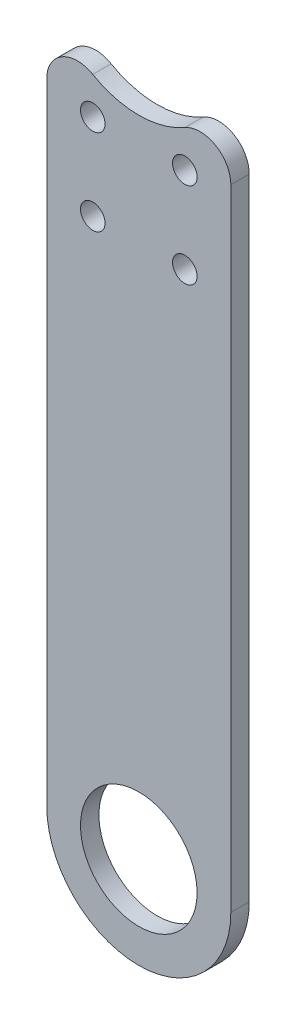
ISO-10303-21;
HEADER;
FILE_DESCRIPTION(('STEP AP214'),'2;1');
FILE_NAME('part.step','',(''),(''),'','','');
FILE_SCHEMA(('AUTOMOTIVE_DESIGN { 1 0 10303 214 1 1 1 1 }'));
ENDSEC;
DATA;
#1=APPLICATION_CONTEXT('core data for automotive mechanical design processes');
#2=APPLICATION_PROTOCOL_DEFINITION('international standard','automotive_design',2000,#1);
#3=PRODUCT_CONTEXT('',#1,'mechanical');
#4=PRODUCT('Part','Part','',(#3));
#5=PRODUCT_RELATED_PRODUCT_CATEGORY('part','',(#4));
#6=PRODUCT_DEFINITION_FORMATION('','',#4);
#7=PRODUCT_DEFINITION_CONTEXT('part definition',#1,'design');
#8=PRODUCT_DEFINITION('design','',#6,#7);
#9=PRODUCT_DEFINITION_SHAPE('','',#8);
#10=(LENGTH_UNIT() NAMED_UNIT(*) SI_UNIT(.MILLI.,.METRE.));
#11=(NAMED_UNIT(*) PLANE_ANGLE_UNIT() SI_UNIT($,.RADIAN.));
#12=(NAMED_UNIT(*) SI_UNIT($,.STERADIAN.) SOLID_ANGLE_UNIT());
#13=UNCERTAINTY_MEASURE_WITH_UNIT(LENGTH_MEASURE(1.E-05),#10,'distance_accuracy_value','');
#14=(GEOMETRIC_REPRESENTATION_CONTEXT(3) GLOBAL_UNCERTAINTY_ASSIGNED_CONTEXT((#13)) GLOBAL_UNIT_ASSIGNED_CONTEXT((#10,
#11,#12)) REPRESENTATION_CONTEXT('',''));
#15=CARTESIAN_POINT('',(0.,0.,0.));
#16=DIRECTION('',(0.,0.,1.));
#17=DIRECTION('',(1.,0.,0.));
#18=AXIS2_PLACEMENT_3D('',#15,#16,#17);
#19=CARTESIAN_POINT('',(0.,0.,3.));
#20=DIRECTION('',(0.,0.,1.));
#21=DIRECTION('',(1.,0.,0.));
#22=AXIS2_PLACEMENT_3D('',#19,#20,#21);
#23=PLANE('',#22);
#24=CARTESIAN_POINT('',(7.5,-19.,3.));
#25=DIRECTION('',(0.,0.,1.));
#26=DIRECTION('',(-1.,0.,0.));
#27=AXIS2_PLACEMENT_3D('',#24,#25,#26);
#28=CIRCLE('',#27,2.);
#29=CARTESIAN_POINT('',(5.5,-19.,3.));
#30=VERTEX_POINT('',#29);
#31=EDGE_CURVE('E292',#30,#30,#28,.T.);
#32=ORIENTED_EDGE('',*,*,#31,.F.);
#33=EDGE_LOOP('',(#32));
#34=FACE_BOUND('',#33,.T.);
#35=CARTESIAN_POINT('',(7.5,-33.,3.));
#36=DIRECTION('',(0.,0.,1.));
#37=DIRECTION('',(-1.,0.,0.));
#38=AXIS2_PLACEMENT_3D('',#35,#36,#37);
#39=CIRCLE('',#38,2.);
#40=CARTESIAN_POINT('',(5.5,-33.,3.));
#41=VERTEX_POINT('',#40);
#42=EDGE_CURVE('E293',#41,#41,#39,.T.);
#43=ORIENTED_EDGE('',*,*,#42,.F.);
#44=EDGE_LOOP('',(#43));
#45=FACE_BOUND('',#44,.T.);
#46=CARTESIAN_POINT('',(-7.5,-33.,3.));
#47=DIRECTION('',(0.,0.,1.));
#48=DIRECTION('',(1.,0.,0.));
#49=AXIS2_PLACEMENT_3D('',#46,#47,#48);
#50=CIRCLE('',#49,2.);
#51=CARTESIAN_POINT('',(-5.5,-33.,3.));
#52=VERTEX_POINT('',#51);
#53=EDGE_CURVE('E296',#52,#52,#50,.T.);
#54=ORIENTED_EDGE('',*,*,#53,.F.);
#55=EDGE_LOOP('',(#54));
#56=FACE_BOUND('',#55,.T.);
#57=CARTESIAN_POINT('',(-7.5,-19.,3.));
#58=DIRECTION('',(0.,0.,1.));
#59=DIRECTION('',(1.,0.,0.));
#60=AXIS2_PLACEMENT_3D('',#57,#58,#59);
#61=CIRCLE('',#60,2.);
#62=CARTESIAN_POINT('',(-5.5,-19.,3.));
#63=VERTEX_POINT('',#62);
#64=EDGE_CURVE('E147',#63,#63,#61,.T.);
#65=ORIENTED_EDGE('',*,*,#64,.F.);
#66=EDGE_LOOP('',(#65));
#67=FACE_BOUND('',#66,.T.);
#68=CARTESIAN_POINT('',(0.,0.,3.));
#69=DIRECTION('',(0.,0.,-1.));
#70=DIRECTION('',(1.,0.,0.));
#71=AXIS2_PLACEMENT_3D('',#68,#69,#70);
#72=CIRCLE('',#71,15.);
#73=CARTESIAN_POINT('',(7.5,-12.9903810567666,3.));
#74=VERTEX_POINT('',#73);
#75=CARTESIAN_POINT('',(-7.50000000000001,-12.9903810567666,3.));
#76=VERTEX_POINT('',#75);
#77=EDGE_CURVE('E103',#74,#76,#72,.T.);
#78=ORIENTED_EDGE('',*,*,#77,.T.);
#79=CARTESIAN_POINT('',(-10.,-17.3205080756888,3.));
#80=DIRECTION('',(0.,0.,1.));
#81=DIRECTION('',(1.,0.,0.));
#82=AXIS2_PLACEMENT_3D('',#79,#80,#81);
#83=CIRCLE('',#82,5.);
#84=CARTESIAN_POINT('',(-15.,-17.3205080756888,3.));
#85=VERTEX_POINT('',#84);
#86=EDGE_CURVE('E46',#76,#85,#83,.T.);
#87=ORIENTED_EDGE('',*,*,#86,.T.);
#88=DIRECTION('',(0.,-1.,0.));
#89=VECTOR('',#88,1.);
#90=CARTESIAN_POINT('',(-15.,0.,3.));
#91=LINE('',#90,#89);
#92=CARTESIAN_POINT('',(-15.,-120.,3.));
#93=VERTEX_POINT('',#92);
#94=EDGE_CURVE('E93',#85,#93,#91,.T.);
#95=ORIENTED_EDGE('',*,*,#94,.T.);
#96=CARTESIAN_POINT('',(0.,-120.,3.));
#97=DIRECTION('',(0.,0.,1.));
#98=DIRECTION('',(1.,0.,0.));
#99=AXIS2_PLACEMENT_3D('',#96,#97,#98);
#100=CIRCLE('',#99,15.);
#101=CARTESIAN_POINT('',(15.,-120.,3.));
#102=VERTEX_POINT('',#101);
#103=EDGE_CURVE('E97',#93,#102,#100,.T.);
#104=ORIENTED_EDGE('',*,*,#103,.T.);
#105=DIRECTION('',(0.,1.,0.));
#106=VECTOR('',#105,1.);
#107=CARTESIAN_POINT('',(15.,-120.,3.));
#108=LINE('',#107,#106);
#109=CARTESIAN_POINT('',(15.,-17.3205080756888,3.));
#110=VERTEX_POINT('',#109);
#111=EDGE_CURVE('E117',#102,#110,#108,.T.);
#112=ORIENTED_EDGE('',*,*,#111,.T.);
#113=CARTESIAN_POINT('',(10.,-17.3205080756888,3.));
#114=DIRECTION('',(0.,0.,1.));
#115=DIRECTION('',(1.,0.,0.));
#116=AXIS2_PLACEMENT_3D('',#113,#114,#115);
#117=CIRCLE('',#116,5.);
#118=EDGE_CURVE('E140',#110,#74,#117,.T.);
#119=ORIENTED_EDGE('',*,*,#118,.T.);
#120=EDGE_LOOP('',(#78,#87,#95,#104,#112,#119));
#121=FACE_BOUND('',#120,.T.);
#122=CARTESIAN_POINT('',(0.,-120.,3.));
#123=DIRECTION('',(0.,0.,1.));
#124=DIRECTION('',(1.,0.,0.));
#125=AXIS2_PLACEMENT_3D('',#122,#123,#124);
#126=CIRCLE('',#125,9.5);
#127=CARTESIAN_POINT('',(9.5,-120.,3.));
#128=VERTEX_POINT('',#127);
#129=EDGE_CURVE('E124',#128,#128,#126,.T.);
#130=ORIENTED_EDGE('',*,*,#129,.F.);
#131=EDGE_LOOP('',(#130));
#132=FACE_BOUND('',#131,.T.);
#133=ADVANCED_FACE('F37',(#34,#45,#56,#67,#121,#132),#23,.T.);
#134=CARTESIAN_POINT('',(0.,0.,0.));
#135=DIRECTION('',(0.,0.,1.));
#136=DIRECTION('',(1.,0.,0.));
#137=AXIS2_PLACEMENT_3D('',#134,#135,#136);
#138=PLANE('',#137);
#139=CARTESIAN_POINT('',(7.5,-19.,0.));
#140=DIRECTION('',(0.,0.,1.));
#141=DIRECTION('',(1.,0.,0.));
#142=AXIS2_PLACEMENT_3D('',#139,#140,#141);
#143=CIRCLE('',#142,2.);
#144=CARTESIAN_POINT('',(9.5,-19.,0.));
#145=VERTEX_POINT('',#144);
#146=EDGE_CURVE('E41',#145,#145,#143,.T.);
#147=ORIENTED_EDGE('',*,*,#146,.T.);
#148=EDGE_LOOP('',(#147));
#149=FACE_BOUND('',#148,.T.);
#150=CARTESIAN_POINT('',(7.5,-33.,0.));
#151=DIRECTION('',(0.,0.,1.));
#152=DIRECTION('',(1.,0.,0.));
#153=AXIS2_PLACEMENT_3D('',#150,#151,#152);
#154=CIRCLE('',#153,2.);
#155=CARTESIAN_POINT('',(9.5,-33.,0.));
#156=VERTEX_POINT('',#155);
#157=EDGE_CURVE('E149',#156,#156,#154,.T.);
#158=ORIENTED_EDGE('',*,*,#157,.T.);
#159=EDGE_LOOP('',(#158));
#160=FACE_BOUND('',#159,.T.);
#161=CARTESIAN_POINT('',(-7.5,-33.,0.));
#162=DIRECTION('',(0.,0.,1.));
#163=DIRECTION('',(1.,0.,0.));
#164=AXIS2_PLACEMENT_3D('',#161,#162,#163);
#165=CIRCLE('',#164,2.);
#166=CARTESIAN_POINT('',(-5.5,-33.,0.));
#167=VERTEX_POINT('',#166);
#168=EDGE_CURVE('E146',#167,#167,#165,.T.);
#169=ORIENTED_EDGE('',*,*,#168,.T.);
#170=EDGE_LOOP('',(#169));
#171=FACE_BOUND('',#170,.T.);
#172=CARTESIAN_POINT('',(-7.5,-19.,0.));
#173=DIRECTION('',(0.,0.,1.));
#174=DIRECTION('',(1.,0.,0.));
#175=AXIS2_PLACEMENT_3D('',#172,#173,#174);
#176=CIRCLE('',#175,2.);
#177=CARTESIAN_POINT('',(-5.5,-19.,0.));
#178=VERTEX_POINT('',#177);
#179=EDGE_CURVE('E143',#178,#178,#176,.T.);
#180=ORIENTED_EDGE('',*,*,#179,.T.);
#181=EDGE_LOOP('',(#180));
#182=FACE_BOUND('',#181,.T.);
#183=DIRECTION('',(0.,-1.,0.));
#184=VECTOR('',#183,1.);
#185=CARTESIAN_POINT('',(-15.,0.,0.));
#186=LINE('',#185,#184);
#187=CARTESIAN_POINT('',(-15.,-17.3205080756888,0.));
#188=VERTEX_POINT('',#187);
#189=CARTESIAN_POINT('',(-15.,-120.,0.));
#190=VERTEX_POINT('',#189);
#191=EDGE_CURVE('E109',#188,#190,#186,.T.);
#192=ORIENTED_EDGE('',*,*,#191,.F.);
#193=CARTESIAN_POINT('',(-10.,-17.3205080756888,0.));
#194=DIRECTION('',(0.,0.,1.));
#195=DIRECTION('',(1.,0.,0.));
#196=AXIS2_PLACEMENT_3D('',#193,#194,#195);
#197=CIRCLE('',#196,5.);
#198=CARTESIAN_POINT('',(-7.50000000000001,-12.9903810567666,0.));
#199=VERTEX_POINT('',#198);
#200=EDGE_CURVE('E134',#188,#199,#197,.F.);
#201=ORIENTED_EDGE('',*,*,#200,.T.);
#202=CARTESIAN_POINT('',(0.,0.,0.));
#203=DIRECTION('',(0.,0.,-1.));
#204=DIRECTION('',(1.,0.,0.));
#205=AXIS2_PLACEMENT_3D('',#202,#203,#204);
#206=CIRCLE('',#205,15.);
#207=CARTESIAN_POINT('',(7.5,-12.9903810567666,0.));
#208=VERTEX_POINT('',#207);
#209=EDGE_CURVE('E122',#208,#199,#206,.T.);
#210=ORIENTED_EDGE('',*,*,#209,.F.);
#211=CARTESIAN_POINT('',(10.,-17.3205080756888,0.));
#212=DIRECTION('',(0.,0.,1.));
#213=DIRECTION('',(1.,0.,0.));
#214=AXIS2_PLACEMENT_3D('',#211,#212,#213);
#215=CIRCLE('',#214,5.);
#216=CARTESIAN_POINT('',(15.,-17.3205080756888,0.));
#217=VERTEX_POINT('',#216);
#218=EDGE_CURVE('E132',#208,#217,#215,.F.);
#219=ORIENTED_EDGE('',*,*,#218,.T.);
#220=DIRECTION('',(0.,1.,0.));
#221=VECTOR('',#220,1.);
#222=CARTESIAN_POINT('',(15.,-120.,0.));
#223=LINE('',#222,#221);
#224=CARTESIAN_POINT('',(15.,-120.,0.));
#225=VERTEX_POINT('',#224);
#226=EDGE_CURVE('E128',#225,#217,#223,.T.);
#227=ORIENTED_EDGE('',*,*,#226,.F.);
#228=CARTESIAN_POINT('',(0.,-120.,0.));
#229=DIRECTION('',(0.,0.,1.));
#230=DIRECTION('',(1.,0.,0.));
#231=AXIS2_PLACEMENT_3D('',#228,#229,#230);
#232=CIRCLE('',#231,15.);
#233=EDGE_CURVE('E126',#190,#225,#232,.T.);
#234=ORIENTED_EDGE('',*,*,#233,.F.);
#235=EDGE_LOOP('',(#192,#201,#210,#219,#227,#234));
#236=FACE_BOUND('',#235,.T.);
#237=CARTESIAN_POINT('',(0.,-120.,0.));
#238=DIRECTION('',(0.,0.,1.));
#239=DIRECTION('',(1.,0.,0.));
#240=AXIS2_PLACEMENT_3D('',#237,#238,#239);
#241=CIRCLE('',#240,9.5);
#242=CARTESIAN_POINT('',(9.5,-120.,0.));
#243=VERTEX_POINT('',#242);
#244=EDGE_CURVE('E154',#243,#243,#241,.T.);
#245=ORIENTED_EDGE('',*,*,#244,.T.);
#246=EDGE_LOOP('',(#245));
#247=FACE_BOUND('',#246,.T.);
#248=ADVANCED_FACE('F169',(#149,#160,#171,#182,#236,#247),#138,.F.);
#249=CARTESIAN_POINT('',(0.,0.,3.));
#250=DIRECTION('',(0.,0.,-1.));
#251=DIRECTION('',(-1.,0.,0.));
#252=AXIS2_PLACEMENT_3D('',#249,#250,#251);
#253=CYLINDRICAL_SURFACE('',#252,15.);
#254=ORIENTED_EDGE('',*,*,#209,.T.);
#255=DIRECTION('',(0.,0.,-1.));
#256=VECTOR('',#255,1.);
#257=CARTESIAN_POINT('',(-7.50000000000002,-12.9903810567666,3.));
#258=LINE('',#257,#256);
#259=EDGE_CURVE('E60',#199,#76,#258,.F.);
#260=ORIENTED_EDGE('',*,*,#259,.T.);
#261=ORIENTED_EDGE('',*,*,#77,.F.);
#262=DIRECTION('',(0.,0.,-1.));
#263=VECTOR('',#262,1.);
#264=CARTESIAN_POINT('',(7.5,-12.9903810567666,3.));
#265=LINE('',#264,#263);
#266=EDGE_CURVE('E136',#74,#208,#265,.T.);
#267=ORIENTED_EDGE('',*,*,#266,.T.);
#268=EDGE_LOOP('',(#254,#260,#261,#267));
#269=FACE_BOUND('',#268,.T.);
#270=ADVANCED_FACE('F174',(#269),#253,.F.);
#271=CARTESIAN_POINT('',(-15.,0.,3.));
#272=DIRECTION('',(1.,0.,0.));
#273=DIRECTION('',(0.,1.,0.));
#274=AXIS2_PLACEMENT_3D('',#271,#272,#273);
#275=PLANE('',#274);
#276=ORIENTED_EDGE('',*,*,#94,.F.);
#277=DIRECTION('',(0.,0.,-1.));
#278=VECTOR('',#277,1.);
#279=CARTESIAN_POINT('',(-15.,-17.3205080756888,3.));
#280=LINE('',#279,#278);
#281=EDGE_CURVE('E112',#85,#188,#280,.T.);
#282=ORIENTED_EDGE('',*,*,#281,.T.);
#283=ORIENTED_EDGE('',*,*,#191,.T.);
#284=DIRECTION('',(0.,0.,-1.));
#285=VECTOR('',#284,1.);
#286=CARTESIAN_POINT('',(-15.,-120.,3.));
#287=LINE('',#286,#285);
#288=EDGE_CURVE('E106',#93,#190,#287,.T.);
#289=ORIENTED_EDGE('',*,*,#288,.F.);
#290=EDGE_LOOP('',(#276,#282,#283,#289));
#291=FACE_BOUND('',#290,.T.);
#292=ADVANCED_FACE('F107',(#291),#275,.F.);
#293=CARTESIAN_POINT('',(0.,-120.,3.));
#294=DIRECTION('',(0.,0.,-1.));
#295=DIRECTION('',(-1.,0.,0.));
#296=AXIS2_PLACEMENT_3D('',#293,#294,#295);
#297=CYLINDRICAL_SURFACE('',#296,15.);
#298=ORIENTED_EDGE('',*,*,#233,.T.);
#299=DIRECTION('',(0.,0.,-1.));
#300=VECTOR('',#299,1.);
#301=CARTESIAN_POINT('',(15.,-120.,3.));
#302=LINE('',#301,#300);
#303=EDGE_CURVE('E113',#102,#225,#302,.T.);
#304=ORIENTED_EDGE('',*,*,#303,.F.);
#305=ORIENTED_EDGE('',*,*,#103,.F.);
#306=ORIENTED_EDGE('',*,*,#288,.T.);
#307=EDGE_LOOP('',(#298,#304,#305,#306));
#308=FACE_BOUND('',#307,.T.);
#309=ADVANCED_FACE('F115',(#308),#297,.T.);
#310=CARTESIAN_POINT('',(15.,-120.,3.));
#311=DIRECTION('',(-1.,0.,0.));
#312=DIRECTION('',(0.,-1.,0.));
#313=AXIS2_PLACEMENT_3D('',#310,#311,#312);
#314=PLANE('',#313);
#315=ORIENTED_EDGE('',*,*,#226,.T.);
#316=DIRECTION('',(0.,0.,-1.));
#317=VECTOR('',#316,1.);
#318=CARTESIAN_POINT('',(15.,-17.3205080756888,3.));
#319=LINE('',#318,#317);
#320=EDGE_CURVE('E11',#217,#110,#319,.F.);
#321=ORIENTED_EDGE('',*,*,#320,.T.);
#322=ORIENTED_EDGE('',*,*,#111,.F.);
#323=ORIENTED_EDGE('',*,*,#303,.T.);
#324=EDGE_LOOP('',(#315,#321,#322,#323));
#325=FACE_BOUND('',#324,.T.);
#326=ADVANCED_FACE('F172',(#325),#314,.F.);
#327=CARTESIAN_POINT('',(0.,-120.,3.));
#328=DIRECTION('',(0.,0.,-1.));
#329=DIRECTION('',(-1.,0.,0.));
#330=AXIS2_PLACEMENT_3D('',#327,#328,#329);
#331=CYLINDRICAL_SURFACE('',#330,9.5);
#332=ORIENTED_EDGE('',*,*,#129,.T.);
#333=EDGE_LOOP('',(#332));
#334=FACE_BOUND('',#333,.T.);
#335=ORIENTED_EDGE('',*,*,#244,.F.);
#336=EDGE_LOOP('',(#335));
#337=FACE_BOUND('',#336,.T.);
#338=ADVANCED_FACE('F191',(#334,#337),#331,.F.);
#339=CARTESIAN_POINT('',(-10.,-17.3205080756888,3.));
#340=DIRECTION('',(0.,0.,-1.));
#341=DIRECTION('',(-1.,0.,0.));
#342=AXIS2_PLACEMENT_3D('',#339,#340,#341);
#343=CYLINDRICAL_SURFACE('',#342,5.);
#344=ORIENTED_EDGE('',*,*,#86,.F.);
#345=ORIENTED_EDGE('',*,*,#259,.F.);
#346=ORIENTED_EDGE('',*,*,#200,.F.);
#347=ORIENTED_EDGE('',*,*,#281,.F.);
#348=EDGE_LOOP('',(#344,#345,#346,#347));
#349=FACE_BOUND('',#348,.T.);
#350=ADVANCED_FACE('F167',(#349),#343,.T.);
#351=CARTESIAN_POINT('',(10.,-17.3205080756888,3.));
#352=DIRECTION('',(0.,0.,-1.));
#353=DIRECTION('',(-1.,0.,0.));
#354=AXIS2_PLACEMENT_3D('',#351,#352,#353);
#355=CYLINDRICAL_SURFACE('',#354,5.);
#356=ORIENTED_EDGE('',*,*,#118,.F.);
#357=ORIENTED_EDGE('',*,*,#320,.F.);
#358=ORIENTED_EDGE('',*,*,#218,.F.);
#359=ORIENTED_EDGE('',*,*,#266,.F.);
#360=EDGE_LOOP('',(#356,#357,#358,#359));
#361=FACE_BOUND('',#360,.T.);
#362=ADVANCED_FACE('F39',(#361),#355,.T.);
#363=CARTESIAN_POINT('',(-7.5,-19.,-7.));
#364=DIRECTION('',(0.,0.,1.));
#365=DIRECTION('',(1.,0.,0.));
#366=AXIS2_PLACEMENT_3D('',#363,#364,#365);
#367=CYLINDRICAL_SURFACE('',#366,2.);
#368=ORIENTED_EDGE('',*,*,#64,.T.);
#369=EDGE_LOOP('',(#368));
#370=FACE_BOUND('',#369,.T.);
#371=ORIENTED_EDGE('',*,*,#179,.F.);
#372=EDGE_LOOP('',(#371));
#373=FACE_BOUND('',#372,.T.);
#374=ADVANCED_FACE('F222',(#370,#373),#367,.F.);
#375=CARTESIAN_POINT('',(-7.5,-33.,-7.));
#376=DIRECTION('',(0.,0.,1.));
#377=DIRECTION('',(1.,0.,0.));
#378=AXIS2_PLACEMENT_3D('',#375,#376,#377);
#379=CYLINDRICAL_SURFACE('',#378,2.);
#380=ORIENTED_EDGE('',*,*,#53,.T.);
#381=EDGE_LOOP('',(#380));
#382=FACE_BOUND('',#381,.T.);
#383=ORIENTED_EDGE('',*,*,#168,.F.);
#384=EDGE_LOOP('',(#383));
#385=FACE_BOUND('',#384,.T.);
#386=ADVANCED_FACE('F228',(#382,#385),#379,.F.);
#387=CARTESIAN_POINT('',(7.5,-33.,-7.));
#388=DIRECTION('',(0.,0.,1.));
#389=DIRECTION('',(1.,0.,0.));
#390=AXIS2_PLACEMENT_3D('',#387,#388,#389);
#391=CYLINDRICAL_SURFACE('',#390,2.);
#392=ORIENTED_EDGE('',*,*,#42,.T.);
#393=EDGE_LOOP('',(#392));
#394=FACE_BOUND('',#393,.T.);
#395=ORIENTED_EDGE('',*,*,#157,.F.);
#396=EDGE_LOOP('',(#395));
#397=FACE_BOUND('',#396,.T.);
#398=ADVANCED_FACE('F236',(#394,#397),#391,.F.);
#399=CARTESIAN_POINT('',(7.5,-19.,-7.));
#400=DIRECTION('',(0.,0.,1.));
#401=DIRECTION('',(1.,0.,0.));
#402=AXIS2_PLACEMENT_3D('',#399,#400,#401);
#403=CYLINDRICAL_SURFACE('',#402,2.);
#404=ORIENTED_EDGE('',*,*,#31,.T.);
#405=EDGE_LOOP('',(#404));
#406=FACE_BOUND('',#405,.T.);
#407=ORIENTED_EDGE('',*,*,#146,.F.);
#408=EDGE_LOOP('',(#407));
#409=FACE_BOUND('',#408,.T.);
#410=ADVANCED_FACE('F244',(#406,#409),#403,.F.);
#411=CLOSED_SHELL('',(#133,#248,#270,#292,#309,#326,#338,#350,#362,#374,#386,#398,#410));
#412=MANIFOLD_SOLID_BREP('B2',#411);
#413=ADVANCED_BREP_SHAPE_REPRESENTATION('',(#18,#412),#14);
#414=SHAPE_DEFINITION_REPRESENTATION(#9,#413);
ENDSEC;
END-ISO-10303-21;
